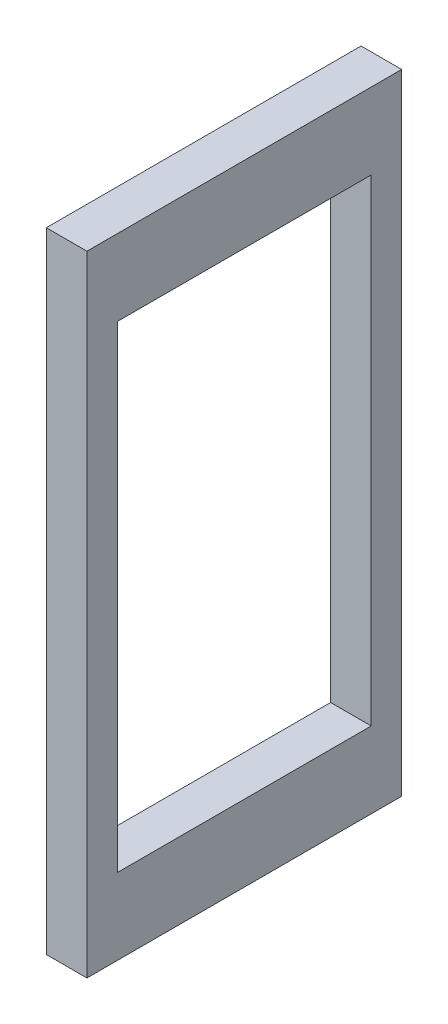
ISO-10303-21;
HEADER;
FILE_DESCRIPTION(('STEP AP214'),'2;1');
FILE_NAME('part.step','',(''),(''),'','','');
FILE_SCHEMA(('AUTOMOTIVE_DESIGN { 1 0 10303 214 1 1 1 1 }'));
ENDSEC;
DATA;
#1=APPLICATION_CONTEXT('core data for automotive mechanical design processes');
#2=APPLICATION_PROTOCOL_DEFINITION('international standard','automotive_design',2000,#1);
#3=PRODUCT_CONTEXT('',#1,'mechanical');
#4=PRODUCT('Part','Part','',(#3));
#5=PRODUCT_RELATED_PRODUCT_CATEGORY('part','',(#4));
#6=PRODUCT_DEFINITION_FORMATION('','',#4);
#7=PRODUCT_DEFINITION_CONTEXT('part definition',#1,'design');
#8=PRODUCT_DEFINITION('design','',#6,#7);
#9=PRODUCT_DEFINITION_SHAPE('','',#8);
#10=(LENGTH_UNIT() NAMED_UNIT(*) SI_UNIT(.MILLI.,.METRE.));
#11=(NAMED_UNIT(*) PLANE_ANGLE_UNIT() SI_UNIT($,.RADIAN.));
#12=(NAMED_UNIT(*) SI_UNIT($,.STERADIAN.) SOLID_ANGLE_UNIT());
#13=UNCERTAINTY_MEASURE_WITH_UNIT(LENGTH_MEASURE(1.E-05),#10,'distance_accuracy_value','');
#14=(GEOMETRIC_REPRESENTATION_CONTEXT(3) GLOBAL_UNCERTAINTY_ASSIGNED_CONTEXT((#13)) GLOBAL_UNIT_ASSIGNED_CONTEXT((#10,
#11,#12)) REPRESENTATION_CONTEXT('',''));
#15=CARTESIAN_POINT('',(0.,0.,0.));
#16=DIRECTION('',(0.,0.,1.));
#17=DIRECTION('',(1.,0.,0.));
#18=AXIS2_PLACEMENT_3D('',#15,#16,#17);
#19=CARTESIAN_POINT('',(2.,0.,-6.8489135449929));
#20=DIRECTION('',(0.,0.,-1.));
#21=DIRECTION('',(-1.,0.,0.));
#22=AXIS2_PLACEMENT_3D('',#19,#20,#21);
#23=PLANE('',#22);
#24=DIRECTION('',(0.,-1.,0.));
#25=VECTOR('',#24,1.);
#26=CARTESIAN_POINT('',(0.,0.,-6.8489135449929));
#27=LINE('',#26,#25);
#28=CARTESIAN_POINT('',(0.,12.0919317948308,-6.8489135449929));
#29=VERTEX_POINT('',#28);
#30=CARTESIAN_POINT('',(0.,-11.4080682051692,-6.8489135449929));
#31=VERTEX_POINT('',#30);
#32=EDGE_CURVE('E162',#29,#31,#27,.T.);
#33=ORIENTED_EDGE('',*,*,#32,.T.);
#34=DIRECTION('',(-1.,0.,0.));
#35=VECTOR('',#34,1.);
#36=CARTESIAN_POINT('',(2.,-11.4080682051692,-6.8489135449929));
#37=LINE('',#36,#35);
#38=CARTESIAN_POINT('',(2.,-11.4080682051692,-6.8489135449929));
#39=VERTEX_POINT('',#38);
#40=EDGE_CURVE('E11',#39,#31,#37,.T.);
#41=ORIENTED_EDGE('',*,*,#40,.F.);
#42=DIRECTION('',(0.,-1.,0.));
#43=VECTOR('',#42,1.);
#44=CARTESIAN_POINT('',(2.,0.,-6.8489135449929));
#45=LINE('',#44,#43);
#46=CARTESIAN_POINT('',(2.,12.0919317948308,-6.8489135449929));
#47=VERTEX_POINT('',#46);
#48=EDGE_CURVE('E125',#47,#39,#45,.T.);
#49=ORIENTED_EDGE('',*,*,#48,.F.);
#50=DIRECTION('',(-1.,0.,0.));
#51=VECTOR('',#50,1.);
#52=CARTESIAN_POINT('',(2.,12.0919317948308,-6.8489135449929));
#53=LINE('',#52,#51);
#54=EDGE_CURVE('E65',#47,#29,#53,.T.);
#55=ORIENTED_EDGE('',*,*,#54,.T.);
#56=EDGE_LOOP('',(#33,#41,#49,#55));
#57=FACE_BOUND('',#56,.T.);
#58=ADVANCED_FACE('F45',(#57),#23,.F.);
#59=CARTESIAN_POINT('',(2.,-11.4080682051692,0.));
#60=DIRECTION('',(0.,-1.,0.));
#61=DIRECTION('',(0.,0.,-1.));
#62=AXIS2_PLACEMENT_3D('',#59,#60,#61);
#63=PLANE('',#62);
#64=DIRECTION('',(0.,0.,1.));
#65=VECTOR('',#64,1.);
#66=CARTESIAN_POINT('',(0.,-11.4080682051692,0.));
#67=LINE('',#66,#65);
#68=CARTESIAN_POINT('',(0.,-11.4080682051692,5.6510864550071));
#69=VERTEX_POINT('',#68);
#70=EDGE_CURVE('E132',#31,#69,#67,.T.);
#71=ORIENTED_EDGE('',*,*,#70,.T.);
#72=DIRECTION('',(-1.,0.,0.));
#73=VECTOR('',#72,1.);
#74=CARTESIAN_POINT('',(2.,-11.4080682051692,5.6510864550071));
#75=LINE('',#74,#73);
#76=CARTESIAN_POINT('',(2.,-11.4080682051692,5.6510864550071));
#77=VERTEX_POINT('',#76);
#78=EDGE_CURVE('E56',#77,#69,#75,.T.);
#79=ORIENTED_EDGE('',*,*,#78,.F.);
#80=DIRECTION('',(0.,0.,1.));
#81=VECTOR('',#80,1.);
#82=CARTESIAN_POINT('',(2.,-11.4080682051692,0.));
#83=LINE('',#82,#81);
#84=EDGE_CURVE('E119',#39,#77,#83,.T.);
#85=ORIENTED_EDGE('',*,*,#84,.F.);
#86=ORIENTED_EDGE('',*,*,#40,.T.);
#87=EDGE_LOOP('',(#71,#79,#85,#86));
#88=FACE_BOUND('',#87,.T.);
#89=ADVANCED_FACE('F131',(#88),#63,.F.);
#90=CARTESIAN_POINT('',(2.,0.,5.6510864550071));
#91=DIRECTION('',(0.,0.,-1.));
#92=DIRECTION('',(0.,1.,0.));
#93=AXIS2_PLACEMENT_3D('',#90,#91,#92);
#94=PLANE('',#93);
#95=DIRECTION('',(0.,-1.,0.));
#96=VECTOR('',#95,1.);
#97=CARTESIAN_POINT('',(0.,0.,5.6510864550071));
#98=LINE('',#97,#96);
#99=CARTESIAN_POINT('',(0.,12.0919317948308,5.6510864550071));
#100=VERTEX_POINT('',#99);
#101=EDGE_CURVE('E167',#100,#69,#98,.T.);
#102=ORIENTED_EDGE('',*,*,#101,.F.);
#103=DIRECTION('',(-1.,0.,0.));
#104=VECTOR('',#103,1.);
#105=CARTESIAN_POINT('',(2.,12.0919317948308,5.6510864550071));
#106=LINE('',#105,#104);
#107=CARTESIAN_POINT('',(2.,12.0919317948308,5.6510864550071));
#108=VERTEX_POINT('',#107);
#109=EDGE_CURVE('E91',#108,#100,#106,.T.);
#110=ORIENTED_EDGE('',*,*,#109,.F.);
#111=DIRECTION('',(0.,-1.,0.));
#112=VECTOR('',#111,1.);
#113=CARTESIAN_POINT('',(2.,0.,5.6510864550071));
#114=LINE('',#113,#112);
#115=EDGE_CURVE('E124',#108,#77,#114,.T.);
#116=ORIENTED_EDGE('',*,*,#115,.T.);
#117=ORIENTED_EDGE('',*,*,#78,.T.);
#118=EDGE_LOOP('',(#102,#110,#116,#117));
#119=FACE_BOUND('',#118,.T.);
#120=ADVANCED_FACE('F137',(#119),#94,.T.);
#121=CARTESIAN_POINT('',(2.,15.8411916199584,0.));
#122=DIRECTION('',(0.,1.,0.));
#123=DIRECTION('',(0.,0.,1.));
#124=AXIS2_PLACEMENT_3D('',#121,#122,#123);
#125=PLANE('',#124);
#126=DIRECTION('',(0.,0.,-1.));
#127=VECTOR('',#126,1.);
#128=CARTESIAN_POINT('',(0.,15.8411916199584,0.));
#129=LINE('',#128,#127);
#130=CARTESIAN_POINT('',(0.,15.8411916199584,7.1510864550071));
#131=VERTEX_POINT('',#130);
#132=CARTESIAN_POINT('',(0.,15.8411916199584,-8.34891354499289));
#133=VERTEX_POINT('',#132);
#134=EDGE_CURVE('E146',#131,#133,#129,.T.);
#135=ORIENTED_EDGE('',*,*,#134,.F.);
#136=DIRECTION('',(-1.,0.,0.));
#137=VECTOR('',#136,1.);
#138=CARTESIAN_POINT('',(2.,15.8411916199584,7.1510864550071));
#139=LINE('',#138,#137);
#140=CARTESIAN_POINT('',(2.,15.8411916199584,7.1510864550071));
#141=VERTEX_POINT('',#140);
#142=EDGE_CURVE('E49',#141,#131,#139,.T.);
#143=ORIENTED_EDGE('',*,*,#142,.F.);
#144=DIRECTION('',(0.,0.,-1.));
#145=VECTOR('',#144,1.);
#146=CARTESIAN_POINT('',(2.,15.8411916199584,0.));
#147=LINE('',#146,#145);
#148=CARTESIAN_POINT('',(2.,15.8411916199584,-8.34891354499289));
#149=VERTEX_POINT('',#148);
#150=EDGE_CURVE('E174',#141,#149,#147,.T.);
#151=ORIENTED_EDGE('',*,*,#150,.T.);
#152=DIRECTION('',(-1.,0.,0.));
#153=VECTOR('',#152,1.);
#154=CARTESIAN_POINT('',(2.,15.8411916199584,-8.34891354499289));
#155=LINE('',#154,#153);
#156=EDGE_CURVE('E142',#149,#133,#155,.T.);
#157=ORIENTED_EDGE('',*,*,#156,.T.);
#158=EDGE_LOOP('',(#135,#143,#151,#157));
#159=FACE_BOUND('',#158,.T.);
#160=ADVANCED_FACE('F47',(#159),#125,.T.);
#161=CARTESIAN_POINT('',(2.,0.,7.1510864550071));
#162=DIRECTION('',(0.,0.,1.));
#163=DIRECTION('',(0.,-1.,0.));
#164=AXIS2_PLACEMENT_3D('',#161,#162,#163);
#165=PLANE('',#164);
#166=DIRECTION('',(0.,1.,0.));
#167=VECTOR('',#166,1.);
#168=CARTESIAN_POINT('',(0.,0.,7.1510864550071));
#169=LINE('',#168,#167);
#170=CARTESIAN_POINT('',(0.,-15.1573280302967,7.1510864550071));
#171=VERTEX_POINT('',#170);
#172=EDGE_CURVE('E150',#171,#131,#169,.T.);
#173=ORIENTED_EDGE('',*,*,#172,.F.);
#174=DIRECTION('',(-1.,0.,0.));
#175=VECTOR('',#174,1.);
#176=CARTESIAN_POINT('',(2.,-15.1573280302967,7.1510864550071));
#177=LINE('',#176,#175);
#178=CARTESIAN_POINT('',(2.,-15.1573280302967,7.1510864550071));
#179=VERTEX_POINT('',#178);
#180=EDGE_CURVE('E183',#179,#171,#177,.T.);
#181=ORIENTED_EDGE('',*,*,#180,.F.);
#182=DIRECTION('',(0.,1.,0.));
#183=VECTOR('',#182,1.);
#184=CARTESIAN_POINT('',(2.,0.,7.1510864550071));
#185=LINE('',#184,#183);
#186=EDGE_CURVE('E194',#179,#141,#185,.T.);
#187=ORIENTED_EDGE('',*,*,#186,.T.);
#188=ORIENTED_EDGE('',*,*,#142,.T.);
#189=EDGE_LOOP('',(#173,#181,#187,#188));
#190=FACE_BOUND('',#189,.T.);
#191=ADVANCED_FACE('F192',(#190),#165,.T.);
#192=CARTESIAN_POINT('',(2.,-15.1573280302968,0.));
#193=DIRECTION('',(0.,-1.,0.));
#194=DIRECTION('',(0.,0.,-1.));
#195=AXIS2_PLACEMENT_3D('',#192,#193,#194);
#196=PLANE('',#195);
#197=DIRECTION('',(0.,0.,1.));
#198=VECTOR('',#197,1.);
#199=CARTESIAN_POINT('',(0.,-15.1573280302968,0.));
#200=LINE('',#199,#198);
#201=CARTESIAN_POINT('',(0.,-15.1573280302967,-8.3489135449929));
#202=VERTEX_POINT('',#201);
#203=EDGE_CURVE('E154',#202,#171,#200,.T.);
#204=ORIENTED_EDGE('',*,*,#203,.F.);
#205=DIRECTION('',(-1.,0.,0.));
#206=VECTOR('',#205,1.);
#207=CARTESIAN_POINT('',(2.,-15.1573280302967,-8.3489135449929));
#208=LINE('',#207,#206);
#209=CARTESIAN_POINT('',(2.,-15.1573280302967,-8.3489135449929));
#210=VERTEX_POINT('',#209);
#211=EDGE_CURVE('E181',#210,#202,#208,.T.);
#212=ORIENTED_EDGE('',*,*,#211,.F.);
#213=DIRECTION('',(0.,0.,1.));
#214=VECTOR('',#213,1.);
#215=CARTESIAN_POINT('',(2.,-15.1573280302968,0.));
#216=LINE('',#215,#214);
#217=EDGE_CURVE('E203',#210,#179,#216,.T.);
#218=ORIENTED_EDGE('',*,*,#217,.T.);
#219=ORIENTED_EDGE('',*,*,#180,.T.);
#220=EDGE_LOOP('',(#204,#212,#218,#219));
#221=FACE_BOUND('',#220,.T.);
#222=ADVANCED_FACE('F200',(#221),#196,.T.);
#223=CARTESIAN_POINT('',(2.,0.,-8.3489135449929));
#224=DIRECTION('',(0.,0.,1.));
#225=DIRECTION('',(0.,-1.,0.));
#226=AXIS2_PLACEMENT_3D('',#223,#224,#225);
#227=PLANE('',#226);
#228=DIRECTION('',(0.,1.,0.));
#229=VECTOR('',#228,1.);
#230=CARTESIAN_POINT('',(0.,0.,-8.3489135449929));
#231=LINE('',#230,#229);
#232=EDGE_CURVE('E158',#202,#133,#231,.T.);
#233=ORIENTED_EDGE('',*,*,#232,.T.);
#234=ORIENTED_EDGE('',*,*,#156,.F.);
#235=DIRECTION('',(0.,1.,0.));
#236=VECTOR('',#235,1.);
#237=CARTESIAN_POINT('',(2.,0.,-8.3489135449929));
#238=LINE('',#237,#236);
#239=EDGE_CURVE('E205',#210,#149,#238,.T.);
#240=ORIENTED_EDGE('',*,*,#239,.F.);
#241=ORIENTED_EDGE('',*,*,#211,.T.);
#242=EDGE_LOOP('',(#233,#234,#240,#241));
#243=FACE_BOUND('',#242,.T.);
#244=ADVANCED_FACE('F206',(#243),#227,.F.);
#245=CARTESIAN_POINT('',(2.,12.0919317948308,0.));
#246=DIRECTION('',(0.,-1.,0.));
#247=DIRECTION('',(0.,0.,-1.));
#248=AXIS2_PLACEMENT_3D('',#245,#246,#247);
#249=PLANE('',#248);
#250=DIRECTION('',(0.,0.,1.));
#251=VECTOR('',#250,1.);
#252=CARTESIAN_POINT('',(0.,12.0919317948308,0.));
#253=LINE('',#252,#251);
#254=EDGE_CURVE('E170',#29,#100,#253,.T.);
#255=ORIENTED_EDGE('',*,*,#254,.F.);
#256=ORIENTED_EDGE('',*,*,#54,.F.);
#257=DIRECTION('',(0.,0.,1.));
#258=VECTOR('',#257,1.);
#259=CARTESIAN_POINT('',(2.,12.0919317948308,0.));
#260=LINE('',#259,#258);
#261=EDGE_CURVE('E139',#47,#108,#260,.T.);
#262=ORIENTED_EDGE('',*,*,#261,.T.);
#263=ORIENTED_EDGE('',*,*,#109,.T.);
#264=EDGE_LOOP('',(#255,#256,#262,#263));
#265=FACE_BOUND('',#264,.T.);
#266=ADVANCED_FACE('F218',(#265),#249,.T.);
#267=CARTESIAN_POINT('',(2.,0.,0.));
#268=DIRECTION('',(1.,0.,0.));
#269=DIRECTION('',(0.,0.,-1.));
#270=AXIS2_PLACEMENT_3D('',#267,#268,#269);
#271=PLANE('',#270);
#272=ORIENTED_EDGE('',*,*,#150,.F.);
#273=ORIENTED_EDGE('',*,*,#186,.F.);
#274=ORIENTED_EDGE('',*,*,#217,.F.);
#275=ORIENTED_EDGE('',*,*,#239,.T.);
#276=EDGE_LOOP('',(#272,#273,#274,#275));
#277=FACE_BOUND('',#276,.T.);
#278=ORIENTED_EDGE('',*,*,#48,.T.);
#279=ORIENTED_EDGE('',*,*,#84,.T.);
#280=ORIENTED_EDGE('',*,*,#115,.F.);
#281=ORIENTED_EDGE('',*,*,#261,.F.);
#282=EDGE_LOOP('',(#278,#279,#280,#281));
#283=FACE_BOUND('',#282,.T.);
#284=ADVANCED_FACE('F121',(#277,#283),#271,.T.);
#285=CARTESIAN_POINT('',(0.,0.,0.));
#286=DIRECTION('',(1.,0.,0.));
#287=DIRECTION('',(0.,0.,-1.));
#288=AXIS2_PLACEMENT_3D('',#285,#286,#287);
#289=PLANE('',#288);
#290=ORIENTED_EDGE('',*,*,#134,.T.);
#291=ORIENTED_EDGE('',*,*,#232,.F.);
#292=ORIENTED_EDGE('',*,*,#203,.T.);
#293=ORIENTED_EDGE('',*,*,#172,.T.);
#294=EDGE_LOOP('',(#290,#291,#292,#293));
#295=FACE_BOUND('',#294,.T.);
#296=ORIENTED_EDGE('',*,*,#32,.F.);
#297=ORIENTED_EDGE('',*,*,#254,.T.);
#298=ORIENTED_EDGE('',*,*,#101,.T.);
#299=ORIENTED_EDGE('',*,*,#70,.F.);
#300=EDGE_LOOP('',(#296,#297,#298,#299));
#301=FACE_BOUND('',#300,.T.);
#302=ADVANCED_FACE('F198',(#295,#301),#289,.F.);
#303=CLOSED_SHELL('',(#58,#89,#120,#160,#191,#222,#244,#266,#284,#302));
#304=MANIFOLD_SOLID_BREP('B2',#303);
#305=ADVANCED_BREP_SHAPE_REPRESENTATION('',(#18,#304),#14);
#306=SHAPE_DEFINITION_REPRESENTATION(#9,#305);
ENDSEC;
END-ISO-10303-21;
